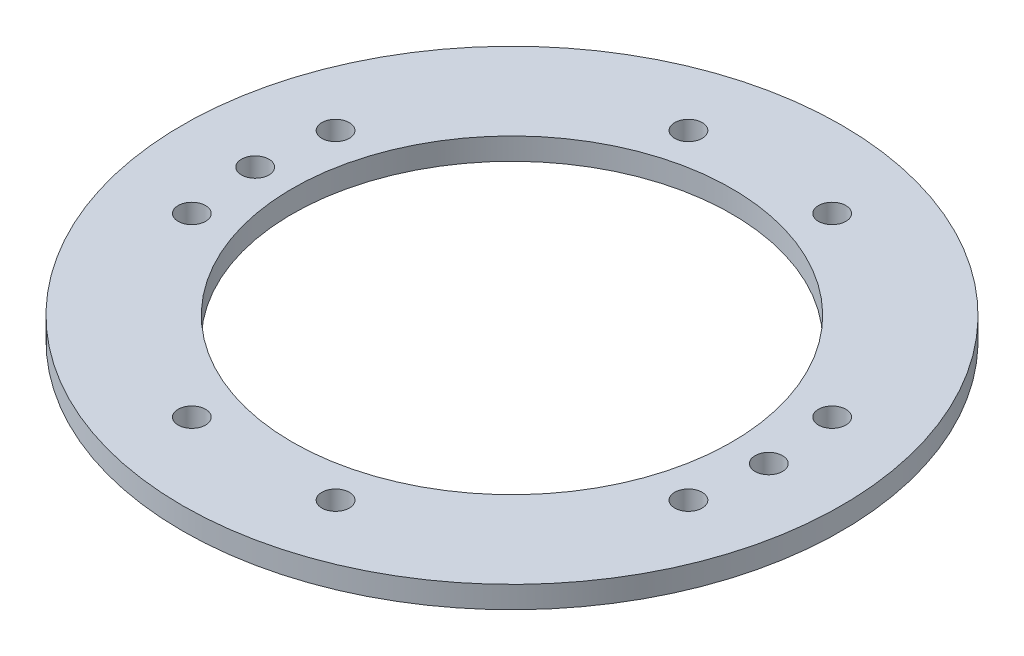
ISO-10303-21;
HEADER;
FILE_DESCRIPTION(('STEP AP214'),'2;1');
FILE_NAME('part.step','',(''),(''),'','','');
FILE_SCHEMA(('AUTOMOTIVE_DESIGN { 1 0 10303 214 1 1 1 1 }'));
ENDSEC;
DATA;
#1=APPLICATION_CONTEXT('core data for automotive mechanical design processes');
#2=APPLICATION_PROTOCOL_DEFINITION('international standard','automotive_design',2000,#1);
#3=PRODUCT_CONTEXT('',#1,'mechanical');
#4=PRODUCT('Part','Part','',(#3));
#5=PRODUCT_RELATED_PRODUCT_CATEGORY('part','',(#4));
#6=PRODUCT_DEFINITION_FORMATION('','',#4);
#7=PRODUCT_DEFINITION_CONTEXT('part definition',#1,'design');
#8=PRODUCT_DEFINITION('design','',#6,#7);
#9=PRODUCT_DEFINITION_SHAPE('','',#8);
#10=(LENGTH_UNIT() NAMED_UNIT(*) SI_UNIT(.MILLI.,.METRE.));
#11=(NAMED_UNIT(*) PLANE_ANGLE_UNIT() SI_UNIT($,.RADIAN.));
#12=(NAMED_UNIT(*) SI_UNIT($,.STERADIAN.) SOLID_ANGLE_UNIT());
#13=UNCERTAINTY_MEASURE_WITH_UNIT(LENGTH_MEASURE(1.E-05),#10,'distance_accuracy_value','');
#14=(GEOMETRIC_REPRESENTATION_CONTEXT(3) GLOBAL_UNCERTAINTY_ASSIGNED_CONTEXT((#13)) GLOBAL_UNIT_ASSIGNED_CONTEXT((#10,
#11,#12)) REPRESENTATION_CONTEXT('',''));
#15=CARTESIAN_POINT('',(0.,0.,0.));
#16=DIRECTION('',(0.,0.,1.));
#17=DIRECTION('',(1.,0.,0.));
#18=AXIS2_PLACEMENT_3D('',#15,#16,#17);
#19=CARTESIAN_POINT('',(0.,5.08,0.));
#20=DIRECTION('',(0.,1.,0.));
#21=DIRECTION('',(0.,0.,1.));
#22=AXIS2_PLACEMENT_3D('',#19,#20,#21);
#23=PLANE('',#22);
#24=CARTESIAN_POINT('',(-57.4120079248848,5.08,-16.6168087977697));
#25=DIRECTION('',(0.,1.,0.));
#26=DIRECTION('',(0.,0.,1.));
#27=AXIS2_PLACEMENT_3D('',#24,#25,#26);
#28=CIRCLE('',#27,3.175);
#29=CARTESIAN_POINT('',(-57.4120079248848,5.08,-13.4418087977697));
#30=VERTEX_POINT('',#29);
#31=EDGE_CURVE('E100',#30,#30,#28,.T.);
#32=ORIENTED_EDGE('',*,*,#31,.F.);
#33=EDGE_LOOP('',(#32));
#34=FACE_BOUND('',#33,.T.);
#35=CARTESIAN_POINT('',(57.412007924888,5.08,16.6168087977707));
#36=DIRECTION('',(0.,1.,0.));
#37=DIRECTION('',(0.,0.,1.));
#38=AXIS2_PLACEMENT_3D('',#35,#36,#37);
#39=CIRCLE('',#38,3.175);
#40=CARTESIAN_POINT('',(57.412007924888,5.08,19.7918087977707));
#41=VERTEX_POINT('',#40);
#42=EDGE_CURVE('E88',#41,#41,#39,.T.);
#43=ORIENTED_EDGE('',*,*,#42,.F.);
#44=EDGE_LOOP('',(#43));
#45=FACE_BOUND('',#44,.T.);
#46=CARTESIAN_POINT('',(16.6168087977751,5.08,57.4120079248849));
#47=DIRECTION('',(0.,1.,0.));
#48=DIRECTION('',(0.,0.,1.));
#49=AXIS2_PLACEMENT_3D('',#46,#47,#48);
#50=CIRCLE('',#49,3.175);
#51=CARTESIAN_POINT('',(16.6168087977751,5.08,60.5870079248849));
#52=VERTEX_POINT('',#51);
#53=EDGE_CURVE('E76',#52,#52,#50,.T.);
#54=ORIENTED_EDGE('',*,*,#53,.F.);
#55=EDGE_LOOP('',(#54));
#56=FACE_BOUND('',#55,.T.);
#57=CARTESIAN_POINT('',(-59.3724179515893,5.08,0.));
#58=DIRECTION('',(0.,1.,0.));
#59=DIRECTION('',(0.,0.,1.));
#60=AXIS2_PLACEMENT_3D('',#57,#58,#59);
#61=CIRCLE('',#60,3.175);
#62=CARTESIAN_POINT('',(-59.3724179515893,5.08,3.175));
#63=VERTEX_POINT('',#62);
#64=EDGE_CURVE('E64',#63,#63,#61,.T.);
#65=ORIENTED_EDGE('',*,*,#64,.F.);
#66=EDGE_LOOP('',(#65));
#67=FACE_BOUND('',#66,.T.);
#68=CARTESIAN_POINT('',(-16.6168087977718,5.08,-57.4120079248859));
#69=DIRECTION('',(0.,1.,0.));
#70=DIRECTION('',(0.,0.,1.));
#71=AXIS2_PLACEMENT_3D('',#68,#69,#70);
#72=CIRCLE('',#71,3.175);
#73=CARTESIAN_POINT('',(-16.6168087977718,5.08,-54.2370079248859));
#74=VERTEX_POINT('',#73);
#75=EDGE_CURVE('E52',#74,#74,#72,.T.);
#76=ORIENTED_EDGE('',*,*,#75,.F.);
#77=EDGE_LOOP('',(#76));
#78=FACE_BOUND('',#77,.T.);
#79=CARTESIAN_POINT('',(0.,5.08,0.));
#80=DIRECTION('',(0.,1.,0.));
#81=DIRECTION('',(0.,0.,1.));
#82=AXIS2_PLACEMENT_3D('',#79,#80,#81);
#83=CIRCLE('',#82,76.2);
#84=CARTESIAN_POINT('',(0.,5.08,76.2));
#85=VERTEX_POINT('',#84);
#86=EDGE_CURVE('E10',#85,#85,#83,.T.);
#87=ORIENTED_EDGE('',*,*,#86,.T.);
#88=EDGE_LOOP('',(#87));
#89=FACE_BOUND('',#88,.T.);
#90=CARTESIAN_POINT('',(0.,5.08,0.));
#91=DIRECTION('',(0.,1.,0.));
#92=DIRECTION('',(0.,0.,1.));
#93=AXIS2_PLACEMENT_3D('',#90,#91,#92);
#94=CIRCLE('',#93,50.8);
#95=CARTESIAN_POINT('',(0.,5.08,50.8));
#96=VERTEX_POINT('',#95);
#97=EDGE_CURVE('E47',#96,#96,#94,.T.);
#98=ORIENTED_EDGE('',*,*,#97,.F.);
#99=EDGE_LOOP('',(#98));
#100=FACE_BOUND('',#99,.T.);
#101=CARTESIAN_POINT('',(16.6168087977718,5.08,-57.4120079248859));
#102=DIRECTION('',(0.,1.,0.));
#103=DIRECTION('',(0.,0.,1.));
#104=AXIS2_PLACEMENT_3D('',#101,#102,#103);
#105=CIRCLE('',#104,3.175);
#106=CARTESIAN_POINT('',(16.6168087977718,5.08,-54.2370079248859));
#107=VERTEX_POINT('',#106);
#108=EDGE_CURVE('E58',#107,#107,#105,.T.);
#109=ORIENTED_EDGE('',*,*,#108,.F.);
#110=EDGE_LOOP('',(#109));
#111=FACE_BOUND('',#110,.T.);
#112=CARTESIAN_POINT('',(57.412007924887,5.08,-16.6168087977739));
#113=DIRECTION('',(0.,1.,0.));
#114=DIRECTION('',(0.,0.,1.));
#115=AXIS2_PLACEMENT_3D('',#112,#113,#114);
#116=CIRCLE('',#115,3.175);
#117=CARTESIAN_POINT('',(57.412007924887,5.08,-13.4418087977739));
#118=VERTEX_POINT('',#117);
#119=EDGE_CURVE('E70',#118,#118,#116,.T.);
#120=ORIENTED_EDGE('',*,*,#119,.F.);
#121=EDGE_LOOP('',(#120));
#122=FACE_BOUND('',#121,.T.);
#123=CARTESIAN_POINT('',(-57.4120079248838,5.08,16.616808797773));
#124=DIRECTION('',(0.,1.,0.));
#125=DIRECTION('',(0.,0.,1.));
#126=AXIS2_PLACEMENT_3D('',#123,#124,#125);
#127=CIRCLE('',#126,3.175);
#128=CARTESIAN_POINT('',(-57.4120079248838,5.08,19.791808797773));
#129=VERTEX_POINT('',#128);
#130=EDGE_CURVE('E82',#129,#129,#127,.T.);
#131=ORIENTED_EDGE('',*,*,#130,.F.);
#132=EDGE_LOOP('',(#131));
#133=FACE_BOUND('',#132,.T.);
#134=CARTESIAN_POINT('',(-16.6168087977686,5.08,57.4120079248869));
#135=DIRECTION('',(0.,1.,0.));
#136=DIRECTION('',(0.,0.,1.));
#137=AXIS2_PLACEMENT_3D('',#134,#135,#136);
#138=CIRCLE('',#137,3.175);
#139=CARTESIAN_POINT('',(-16.6168087977686,5.08,60.5870079248869));
#140=VERTEX_POINT('',#139);
#141=EDGE_CURVE('E94',#140,#140,#138,.T.);
#142=ORIENTED_EDGE('',*,*,#141,.F.);
#143=EDGE_LOOP('',(#142));
#144=FACE_BOUND('',#143,.T.);
#145=CARTESIAN_POINT('',(59.3724179515893,5.08,4.14595378639938E-13));
#146=DIRECTION('',(0.,1.,0.));
#147=DIRECTION('',(0.,0.,1.));
#148=AXIS2_PLACEMENT_3D('',#145,#146,#147);
#149=CIRCLE('',#148,3.175);
#150=CARTESIAN_POINT('',(59.3724179515893,5.08,3.17500000000041));
#151=VERTEX_POINT('',#150);
#152=EDGE_CURVE('E106',#151,#151,#149,.T.);
#153=ORIENTED_EDGE('',*,*,#152,.F.);
#154=EDGE_LOOP('',(#153));
#155=FACE_BOUND('',#154,.T.);
#156=ADVANCED_FACE('F36',(#34,#45,#56,#67,#78,#89,#100,#111,#122,#133,#144,#155),#23,.T.);
#157=CARTESIAN_POINT('',(0.,0.,0.));
#158=DIRECTION('',(0.,1.,0.));
#159=DIRECTION('',(0.,0.,1.));
#160=AXIS2_PLACEMENT_3D('',#157,#158,#159);
#161=PLANE('',#160);
#162=CARTESIAN_POINT('',(0.,0.,0.));
#163=DIRECTION('',(0.,1.,0.));
#164=DIRECTION('',(0.,0.,1.));
#165=AXIS2_PLACEMENT_3D('',#162,#163,#164);
#166=CIRCLE('',#165,76.2);
#167=CARTESIAN_POINT('',(0.,0.,76.2));
#168=VERTEX_POINT('',#167);
#169=EDGE_CURVE('E40',#168,#168,#166,.T.);
#170=ORIENTED_EDGE('',*,*,#169,.F.);
#171=EDGE_LOOP('',(#170));
#172=FACE_BOUND('',#171,.T.);
#173=CARTESIAN_POINT('',(0.,0.,0.));
#174=DIRECTION('',(0.,1.,0.));
#175=DIRECTION('',(0.,0.,1.));
#176=AXIS2_PLACEMENT_3D('',#173,#174,#175);
#177=CIRCLE('',#176,50.8);
#178=CARTESIAN_POINT('',(0.,0.,50.8));
#179=VERTEX_POINT('',#178);
#180=EDGE_CURVE('E49',#179,#179,#177,.T.);
#181=ORIENTED_EDGE('',*,*,#180,.T.);
#182=EDGE_LOOP('',(#181));
#183=FACE_BOUND('',#182,.T.);
#184=CARTESIAN_POINT('',(-16.6168087977718,0.,-57.4120079248859));
#185=DIRECTION('',(0.,1.,0.));
#186=DIRECTION('',(0.,0.,1.));
#187=AXIS2_PLACEMENT_3D('',#184,#185,#186);
#188=CIRCLE('',#187,3.175);
#189=CARTESIAN_POINT('',(-16.6168087977718,0.,-54.2370079248859));
#190=VERTEX_POINT('',#189);
#191=EDGE_CURVE('E55',#190,#190,#188,.T.);
#192=ORIENTED_EDGE('',*,*,#191,.T.);
#193=EDGE_LOOP('',(#192));
#194=FACE_BOUND('',#193,.T.);
#195=CARTESIAN_POINT('',(16.6168087977718,0.,-57.4120079248859));
#196=DIRECTION('',(0.,1.,0.));
#197=DIRECTION('',(0.,0.,1.));
#198=AXIS2_PLACEMENT_3D('',#195,#196,#197);
#199=CIRCLE('',#198,3.175);
#200=CARTESIAN_POINT('',(16.6168087977718,0.,-54.2370079248859));
#201=VERTEX_POINT('',#200);
#202=EDGE_CURVE('E61',#201,#201,#199,.T.);
#203=ORIENTED_EDGE('',*,*,#202,.T.);
#204=EDGE_LOOP('',(#203));
#205=FACE_BOUND('',#204,.T.);
#206=CARTESIAN_POINT('',(-59.3724179515893,0.,0.));
#207=DIRECTION('',(0.,1.,0.));
#208=DIRECTION('',(0.,0.,1.));
#209=AXIS2_PLACEMENT_3D('',#206,#207,#208);
#210=CIRCLE('',#209,3.175);
#211=CARTESIAN_POINT('',(-59.3724179515893,0.,3.175));
#212=VERTEX_POINT('',#211);
#213=EDGE_CURVE('E67',#212,#212,#210,.T.);
#214=ORIENTED_EDGE('',*,*,#213,.T.);
#215=EDGE_LOOP('',(#214));
#216=FACE_BOUND('',#215,.T.);
#217=CARTESIAN_POINT('',(57.412007924887,0.,-16.6168087977739));
#218=DIRECTION('',(0.,1.,0.));
#219=DIRECTION('',(0.,0.,1.));
#220=AXIS2_PLACEMENT_3D('',#217,#218,#219);
#221=CIRCLE('',#220,3.175);
#222=CARTESIAN_POINT('',(57.412007924887,0.,-13.4418087977739));
#223=VERTEX_POINT('',#222);
#224=EDGE_CURVE('E73',#223,#223,#221,.T.);
#225=ORIENTED_EDGE('',*,*,#224,.T.);
#226=EDGE_LOOP('',(#225));
#227=FACE_BOUND('',#226,.T.);
#228=CARTESIAN_POINT('',(16.6168087977751,0.,57.4120079248849));
#229=DIRECTION('',(0.,1.,0.));
#230=DIRECTION('',(0.,0.,1.));
#231=AXIS2_PLACEMENT_3D('',#228,#229,#230);
#232=CIRCLE('',#231,3.175);
#233=CARTESIAN_POINT('',(16.6168087977751,0.,60.5870079248849));
#234=VERTEX_POINT('',#233);
#235=EDGE_CURVE('E79',#234,#234,#232,.T.);
#236=ORIENTED_EDGE('',*,*,#235,.T.);
#237=EDGE_LOOP('',(#236));
#238=FACE_BOUND('',#237,.T.);
#239=CARTESIAN_POINT('',(-57.4120079248838,0.,16.616808797773));
#240=DIRECTION('',(0.,1.,0.));
#241=DIRECTION('',(0.,0.,1.));
#242=AXIS2_PLACEMENT_3D('',#239,#240,#241);
#243=CIRCLE('',#242,3.175);
#244=CARTESIAN_POINT('',(-57.4120079248838,0.,19.791808797773));
#245=VERTEX_POINT('',#244);
#246=EDGE_CURVE('E85',#245,#245,#243,.T.);
#247=ORIENTED_EDGE('',*,*,#246,.T.);
#248=EDGE_LOOP('',(#247));
#249=FACE_BOUND('',#248,.T.);
#250=CARTESIAN_POINT('',(57.412007924888,0.,16.6168087977707));
#251=DIRECTION('',(0.,1.,0.));
#252=DIRECTION('',(0.,0.,1.));
#253=AXIS2_PLACEMENT_3D('',#250,#251,#252);
#254=CIRCLE('',#253,3.175);
#255=CARTESIAN_POINT('',(57.412007924888,0.,19.7918087977707));
#256=VERTEX_POINT('',#255);
#257=EDGE_CURVE('E91',#256,#256,#254,.T.);
#258=ORIENTED_EDGE('',*,*,#257,.T.);
#259=EDGE_LOOP('',(#258));
#260=FACE_BOUND('',#259,.T.);
#261=CARTESIAN_POINT('',(-16.6168087977686,0.,57.4120079248869));
#262=DIRECTION('',(0.,1.,0.));
#263=DIRECTION('',(0.,0.,1.));
#264=AXIS2_PLACEMENT_3D('',#261,#262,#263);
#265=CIRCLE('',#264,3.175);
#266=CARTESIAN_POINT('',(-16.6168087977686,0.,60.5870079248869));
#267=VERTEX_POINT('',#266);
#268=EDGE_CURVE('E97',#267,#267,#265,.T.);
#269=ORIENTED_EDGE('',*,*,#268,.T.);
#270=EDGE_LOOP('',(#269));
#271=FACE_BOUND('',#270,.T.);
#272=CARTESIAN_POINT('',(-57.4120079248848,0.,-16.6168087977697));
#273=DIRECTION('',(0.,1.,0.));
#274=DIRECTION('',(0.,0.,1.));
#275=AXIS2_PLACEMENT_3D('',#272,#273,#274);
#276=CIRCLE('',#275,3.175);
#277=CARTESIAN_POINT('',(-57.4120079248848,0.,-13.4418087977697));
#278=VERTEX_POINT('',#277);
#279=EDGE_CURVE('E103',#278,#278,#276,.T.);
#280=ORIENTED_EDGE('',*,*,#279,.T.);
#281=EDGE_LOOP('',(#280));
#282=FACE_BOUND('',#281,.T.);
#283=CARTESIAN_POINT('',(59.3724179515893,0.,4.14595378639938E-13));
#284=DIRECTION('',(0.,1.,0.));
#285=DIRECTION('',(0.,0.,1.));
#286=AXIS2_PLACEMENT_3D('',#283,#284,#285);
#287=CIRCLE('',#286,3.175);
#288=CARTESIAN_POINT('',(59.3724179515893,0.,3.17500000000041));
#289=VERTEX_POINT('',#288);
#290=EDGE_CURVE('E109',#289,#289,#287,.T.);
#291=ORIENTED_EDGE('',*,*,#290,.T.);
#292=EDGE_LOOP('',(#291));
#293=FACE_BOUND('',#292,.T.);
#294=ADVANCED_FACE('F119',(#172,#183,#194,#205,#216,#227,#238,#249,#260,#271,#282,#293),#161,.F.);
#295=CARTESIAN_POINT('',(0.,5.08,0.));
#296=DIRECTION('',(0.,-1.,0.));
#297=DIRECTION('',(0.,0.,-1.));
#298=AXIS2_PLACEMENT_3D('',#295,#296,#297);
#299=CYLINDRICAL_SURFACE('',#298,76.2);
#300=ORIENTED_EDGE('',*,*,#86,.F.);
#301=EDGE_LOOP('',(#300));
#302=FACE_BOUND('',#301,.T.);
#303=ORIENTED_EDGE('',*,*,#169,.T.);
#304=EDGE_LOOP('',(#303));
#305=FACE_BOUND('',#304,.T.);
#306=ADVANCED_FACE('F38',(#302,#305),#299,.T.);
#307=CARTESIAN_POINT('',(0.,5.08,0.));
#308=DIRECTION('',(0.,-1.,0.));
#309=DIRECTION('',(0.,0.,-1.));
#310=AXIS2_PLACEMENT_3D('',#307,#308,#309);
#311=CYLINDRICAL_SURFACE('',#310,50.8);
#312=ORIENTED_EDGE('',*,*,#97,.T.);
#313=EDGE_LOOP('',(#312));
#314=FACE_BOUND('',#313,.T.);
#315=ORIENTED_EDGE('',*,*,#180,.F.);
#316=EDGE_LOOP('',(#315));
#317=FACE_BOUND('',#316,.T.);
#318=ADVANCED_FACE('F129',(#314,#317),#311,.F.);
#319=CARTESIAN_POINT('',(-16.6168087977718,5.08,-57.4120079248859));
#320=DIRECTION('',(0.,-1.,0.));
#321=DIRECTION('',(0.,0.,-1.));
#322=AXIS2_PLACEMENT_3D('',#319,#320,#321);
#323=CYLINDRICAL_SURFACE('',#322,3.175);
#324=ORIENTED_EDGE('',*,*,#75,.T.);
#325=EDGE_LOOP('',(#324));
#326=FACE_BOUND('',#325,.T.);
#327=ORIENTED_EDGE('',*,*,#191,.F.);
#328=EDGE_LOOP('',(#327));
#329=FACE_BOUND('',#328,.T.);
#330=ADVANCED_FACE('F132',(#326,#329),#323,.F.);
#331=CARTESIAN_POINT('',(16.6168087977718,5.08,-57.4120079248859));
#332=DIRECTION('',(0.,-1.,0.));
#333=DIRECTION('',(0.,0.,-1.));
#334=AXIS2_PLACEMENT_3D('',#331,#332,#333);
#335=CYLINDRICAL_SURFACE('',#334,3.175);
#336=ORIENTED_EDGE('',*,*,#108,.T.);
#337=EDGE_LOOP('',(#336));
#338=FACE_BOUND('',#337,.T.);
#339=ORIENTED_EDGE('',*,*,#202,.F.);
#340=EDGE_LOOP('',(#339));
#341=FACE_BOUND('',#340,.T.);
#342=ADVANCED_FACE('F136',(#338,#341),#335,.F.);
#343=CARTESIAN_POINT('',(-59.3724179515893,5.08,0.));
#344=DIRECTION('',(0.,-1.,0.));
#345=DIRECTION('',(0.,0.,-1.));
#346=AXIS2_PLACEMENT_3D('',#343,#344,#345);
#347=CYLINDRICAL_SURFACE('',#346,3.175);
#348=ORIENTED_EDGE('',*,*,#64,.T.);
#349=EDGE_LOOP('',(#348));
#350=FACE_BOUND('',#349,.T.);
#351=ORIENTED_EDGE('',*,*,#213,.F.);
#352=EDGE_LOOP('',(#351));
#353=FACE_BOUND('',#352,.T.);
#354=ADVANCED_FACE('F140',(#350,#353),#347,.F.);
#355=CARTESIAN_POINT('',(57.412007924887,5.08,-16.6168087977739));
#356=DIRECTION('',(0.,-1.,0.));
#357=DIRECTION('',(0.,0.,-1.));
#358=AXIS2_PLACEMENT_3D('',#355,#356,#357);
#359=CYLINDRICAL_SURFACE('',#358,3.175);
#360=ORIENTED_EDGE('',*,*,#119,.T.);
#361=EDGE_LOOP('',(#360));
#362=FACE_BOUND('',#361,.T.);
#363=ORIENTED_EDGE('',*,*,#224,.F.);
#364=EDGE_LOOP('',(#363));
#365=FACE_BOUND('',#364,.T.);
#366=ADVANCED_FACE('F144',(#362,#365),#359,.F.);
#367=CARTESIAN_POINT('',(16.6168087977751,5.08,57.4120079248849));
#368=DIRECTION('',(0.,-1.,0.));
#369=DIRECTION('',(0.,0.,-1.));
#370=AXIS2_PLACEMENT_3D('',#367,#368,#369);
#371=CYLINDRICAL_SURFACE('',#370,3.175);
#372=ORIENTED_EDGE('',*,*,#53,.T.);
#373=EDGE_LOOP('',(#372));
#374=FACE_BOUND('',#373,.T.);
#375=ORIENTED_EDGE('',*,*,#235,.F.);
#376=EDGE_LOOP('',(#375));
#377=FACE_BOUND('',#376,.T.);
#378=ADVANCED_FACE('F148',(#374,#377),#371,.F.);
#379=CARTESIAN_POINT('',(-57.4120079248838,5.08,16.616808797773));
#380=DIRECTION('',(0.,-1.,0.));
#381=DIRECTION('',(0.,0.,-1.));
#382=AXIS2_PLACEMENT_3D('',#379,#380,#381);
#383=CYLINDRICAL_SURFACE('',#382,3.175);
#384=ORIENTED_EDGE('',*,*,#130,.T.);
#385=EDGE_LOOP('',(#384));
#386=FACE_BOUND('',#385,.T.);
#387=ORIENTED_EDGE('',*,*,#246,.F.);
#388=EDGE_LOOP('',(#387));
#389=FACE_BOUND('',#388,.T.);
#390=ADVANCED_FACE('F152',(#386,#389),#383,.F.);
#391=CARTESIAN_POINT('',(57.412007924888,5.08,16.6168087977707));
#392=DIRECTION('',(0.,-1.,0.));
#393=DIRECTION('',(0.,0.,-1.));
#394=AXIS2_PLACEMENT_3D('',#391,#392,#393);
#395=CYLINDRICAL_SURFACE('',#394,3.175);
#396=ORIENTED_EDGE('',*,*,#42,.T.);
#397=EDGE_LOOP('',(#396));
#398=FACE_BOUND('',#397,.T.);
#399=ORIENTED_EDGE('',*,*,#257,.F.);
#400=EDGE_LOOP('',(#399));
#401=FACE_BOUND('',#400,.T.);
#402=ADVANCED_FACE('F156',(#398,#401),#395,.F.);
#403=CARTESIAN_POINT('',(-16.6168087977686,5.08,57.4120079248869));
#404=DIRECTION('',(0.,-1.,0.));
#405=DIRECTION('',(0.,0.,-1.));
#406=AXIS2_PLACEMENT_3D('',#403,#404,#405);
#407=CYLINDRICAL_SURFACE('',#406,3.175);
#408=ORIENTED_EDGE('',*,*,#141,.T.);
#409=EDGE_LOOP('',(#408));
#410=FACE_BOUND('',#409,.T.);
#411=ORIENTED_EDGE('',*,*,#268,.F.);
#412=EDGE_LOOP('',(#411));
#413=FACE_BOUND('',#412,.T.);
#414=ADVANCED_FACE('F160',(#410,#413),#407,.F.);
#415=CARTESIAN_POINT('',(-57.4120079248848,5.08,-16.6168087977697));
#416=DIRECTION('',(0.,-1.,0.));
#417=DIRECTION('',(0.,0.,-1.));
#418=AXIS2_PLACEMENT_3D('',#415,#416,#417);
#419=CYLINDRICAL_SURFACE('',#418,3.175);
#420=ORIENTED_EDGE('',*,*,#31,.T.);
#421=EDGE_LOOP('',(#420));
#422=FACE_BOUND('',#421,.T.);
#423=ORIENTED_EDGE('',*,*,#279,.F.);
#424=EDGE_LOOP('',(#423));
#425=FACE_BOUND('',#424,.T.);
#426=ADVANCED_FACE('F164',(#422,#425),#419,.F.);
#427=CARTESIAN_POINT('',(59.3724179515893,5.08,4.14595378639938E-13));
#428=DIRECTION('',(0.,-1.,0.));
#429=DIRECTION('',(0.,0.,-1.));
#430=AXIS2_PLACEMENT_3D('',#427,#428,#429);
#431=CYLINDRICAL_SURFACE('',#430,3.175);
#432=ORIENTED_EDGE('',*,*,#152,.T.);
#433=EDGE_LOOP('',(#432));
#434=FACE_BOUND('',#433,.T.);
#435=ORIENTED_EDGE('',*,*,#290,.F.);
#436=EDGE_LOOP('',(#435));
#437=FACE_BOUND('',#436,.T.);
#438=ADVANCED_FACE('F115',(#434,#437),#431,.F.);
#439=CLOSED_SHELL('',(#156,#294,#306,#318,#330,#342,#354,#366,#378,#390,#402,#414,#426,#438));
#440=MANIFOLD_SOLID_BREP('B2',#439);
#441=ADVANCED_BREP_SHAPE_REPRESENTATION('',(#18,#440),#14);
#442=SHAPE_DEFINITION_REPRESENTATION(#9,#441);
ENDSEC;
END-ISO-10303-21;
